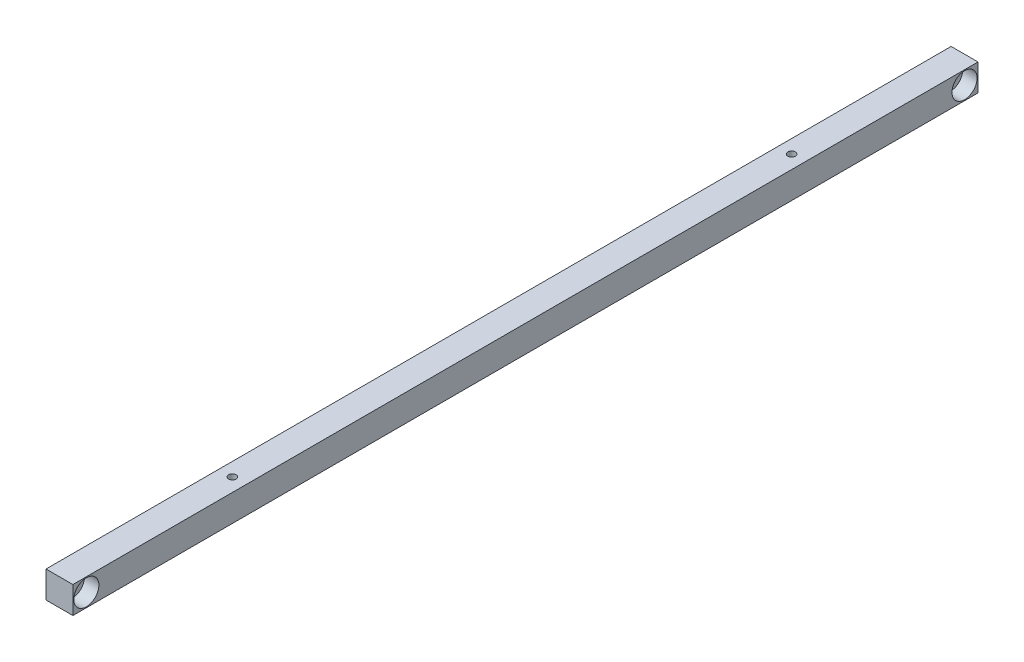
ISO-10303-21;
HEADER;
FILE_DESCRIPTION(('STEP AP214'),'2;1');
FILE_NAME('part.step','',(''),(''),'','','');
FILE_SCHEMA(('AUTOMOTIVE_DESIGN { 1 0 10303 214 1 1 1 1 }'));
ENDSEC;
DATA;
#1=APPLICATION_CONTEXT('core data for automotive mechanical design processes');
#2=APPLICATION_PROTOCOL_DEFINITION('international standard','automotive_design',2000,#1);
#3=PRODUCT_CONTEXT('',#1,'mechanical');
#4=PRODUCT('Part','Part','',(#3));
#5=PRODUCT_RELATED_PRODUCT_CATEGORY('part','',(#4));
#6=PRODUCT_DEFINITION_FORMATION('','',#4);
#7=PRODUCT_DEFINITION_CONTEXT('part definition',#1,'design');
#8=PRODUCT_DEFINITION('design','',#6,#7);
#9=PRODUCT_DEFINITION_SHAPE('','',#8);
#10=(LENGTH_UNIT() NAMED_UNIT(*) SI_UNIT(.MILLI.,.METRE.));
#11=(NAMED_UNIT(*) PLANE_ANGLE_UNIT() SI_UNIT($,.RADIAN.));
#12=(NAMED_UNIT(*) SI_UNIT($,.STERADIAN.) SOLID_ANGLE_UNIT());
#13=UNCERTAINTY_MEASURE_WITH_UNIT(LENGTH_MEASURE(1.E-05),#10,'distance_accuracy_value','');
#14=(GEOMETRIC_REPRESENTATION_CONTEXT(3) GLOBAL_UNCERTAINTY_ASSIGNED_CONTEXT((#13)) GLOBAL_UNIT_ASSIGNED_CONTEXT((#10,
#11,#12)) REPRESENTATION_CONTEXT('',''));
#15=CARTESIAN_POINT('',(0.,0.,0.));
#16=DIRECTION('',(0.,0.,1.));
#17=DIRECTION('',(1.,0.,0.));
#18=AXIS2_PLACEMENT_3D('',#15,#16,#17);
#19=CARTESIAN_POINT('',(-7.5,-7.5,252.5));
#20=DIRECTION('',(1.,0.,0.));
#21=DIRECTION('',(0.,0.,-1.));
#22=AXIS2_PLACEMENT_3D('',#19,#20,#21);
#23=PLANE('',#22);
#24=CARTESIAN_POINT('',(-7.5,0.,245.));
#25=DIRECTION('',(1.,0.,0.));
#26=DIRECTION('',(0.,0.,-1.));
#27=AXIS2_PLACEMENT_3D('',#24,#25,#26);
#28=CIRCLE('',#27,4.25000000000001);
#29=CARTESIAN_POINT('',(-7.5,0.,240.75));
#30=VERTEX_POINT('',#29);
#31=EDGE_CURVE('E162',#30,#30,#28,.T.);
#32=ORIENTED_EDGE('',*,*,#31,.T.);
#33=EDGE_LOOP('',(#32));
#34=FACE_BOUND('',#33,.T.);
#35=CARTESIAN_POINT('',(-7.5,0.,-245.));
#36=DIRECTION('',(1.,0.,0.));
#37=DIRECTION('',(0.,0.,-1.));
#38=AXIS2_PLACEMENT_3D('',#35,#36,#37);
#39=CIRCLE('',#38,4.25000000000001);
#40=CARTESIAN_POINT('',(-7.5,0.,-249.25));
#41=VERTEX_POINT('',#40);
#42=EDGE_CURVE('E121',#41,#41,#39,.T.);
#43=ORIENTED_EDGE('',*,*,#42,.T.);
#44=EDGE_LOOP('',(#43));
#45=FACE_BOUND('',#44,.T.);
#46=DIRECTION('',(0.,-1.,0.));
#47=VECTOR('',#46,1.);
#48=CARTESIAN_POINT('',(-7.5,-7.5,-252.5));
#49=LINE('',#48,#47);
#50=CARTESIAN_POINT('',(-7.5,7.5,-252.5));
#51=VERTEX_POINT('',#50);
#52=CARTESIAN_POINT('',(-7.5,-7.5,-252.5));
#53=VERTEX_POINT('',#52);
#54=EDGE_CURVE('E117',#51,#53,#49,.T.);
#55=ORIENTED_EDGE('',*,*,#54,.T.);
#56=DIRECTION('',(0.,0.,-1.));
#57=VECTOR('',#56,1.);
#58=CARTESIAN_POINT('',(-7.5,-7.5,252.5));
#59=LINE('',#58,#57);
#60=CARTESIAN_POINT('',(-7.5,-7.5,252.5));
#61=VERTEX_POINT('',#60);
#62=EDGE_CURVE('E11',#61,#53,#59,.T.);
#63=ORIENTED_EDGE('',*,*,#62,.F.);
#64=DIRECTION('',(0.,-1.,0.));
#65=VECTOR('',#64,1.);
#66=CARTESIAN_POINT('',(-7.5,-7.5,252.5));
#67=LINE('',#66,#65);
#68=CARTESIAN_POINT('',(-7.5,7.5,252.5));
#69=VERTEX_POINT('',#68);
#70=EDGE_CURVE('E99',#69,#61,#67,.T.);
#71=ORIENTED_EDGE('',*,*,#70,.F.);
#72=DIRECTION('',(0.,0.,-1.));
#73=VECTOR('',#72,1.);
#74=CARTESIAN_POINT('',(-7.5,7.5,252.5));
#75=LINE('',#74,#73);
#76=EDGE_CURVE('E113',#69,#51,#75,.T.);
#77=ORIENTED_EDGE('',*,*,#76,.T.);
#78=EDGE_LOOP('',(#55,#63,#71,#77));
#79=FACE_BOUND('',#78,.T.);
#80=ADVANCED_FACE('F45',(#34,#45,#79),#23,.F.);
#81=CARTESIAN_POINT('',(7.5,-7.5,252.5));
#82=DIRECTION('',(0.,1.,0.));
#83=DIRECTION('',(-1.,0.,0.));
#84=AXIS2_PLACEMENT_3D('',#81,#82,#83);
#85=PLANE('',#84);
#86=CARTESIAN_POINT('',(0.,-7.5,-155.996395214031));
#87=DIRECTION('',(0.,-1.,0.));
#88=DIRECTION('',(0.,0.,-1.));
#89=AXIS2_PLACEMENT_3D('',#86,#87,#88);
#90=CIRCLE('',#89,2.525);
#91=CARTESIAN_POINT('',(0.,-7.5,-158.521395214031));
#92=VERTEX_POINT('',#91);
#93=EDGE_CURVE('E419',#92,#92,#90,.T.);
#94=ORIENTED_EDGE('',*,*,#93,.F.);
#95=EDGE_LOOP('',(#94));
#96=FACE_BOUND('',#95,.T.);
#97=CARTESIAN_POINT('',(0.,-7.5,155.996395214031));
#98=DIRECTION('',(0.,-1.,0.));
#99=DIRECTION('',(0.,0.,-1.));
#100=AXIS2_PLACEMENT_3D('',#97,#98,#99);
#101=CIRCLE('',#100,2.525);
#102=CARTESIAN_POINT('',(0.,-7.5,153.471395214031));
#103=VERTEX_POINT('',#102);
#104=EDGE_CURVE('E145',#103,#103,#101,.T.);
#105=ORIENTED_EDGE('',*,*,#104,.F.);
#106=EDGE_LOOP('',(#105));
#107=FACE_BOUND('',#106,.T.);
#108=DIRECTION('',(1.,0.,0.));
#109=VECTOR('',#108,1.);
#110=CARTESIAN_POINT('',(7.5,-7.5,-252.5));
#111=LINE('',#110,#109);
#112=CARTESIAN_POINT('',(7.5,-7.5,-252.5));
#113=VERTEX_POINT('',#112);
#114=EDGE_CURVE('E104',#53,#113,#111,.T.);
#115=ORIENTED_EDGE('',*,*,#114,.T.);
#116=DIRECTION('',(0.,0.,-1.));
#117=VECTOR('',#116,1.);
#118=CARTESIAN_POINT('',(7.5,-7.5,252.5));
#119=LINE('',#118,#117);
#120=CARTESIAN_POINT('',(7.5,-7.5,252.5));
#121=VERTEX_POINT('',#120);
#122=EDGE_CURVE('E55',#121,#113,#119,.T.);
#123=ORIENTED_EDGE('',*,*,#122,.F.);
#124=DIRECTION('',(1.,0.,0.));
#125=VECTOR('',#124,1.);
#126=CARTESIAN_POINT('',(7.5,-7.5,252.5));
#127=LINE('',#126,#125);
#128=EDGE_CURVE('E94',#61,#121,#127,.T.);
#129=ORIENTED_EDGE('',*,*,#128,.F.);
#130=ORIENTED_EDGE('',*,*,#62,.T.);
#131=EDGE_LOOP('',(#115,#123,#129,#130));
#132=FACE_BOUND('',#131,.T.);
#133=ADVANCED_FACE('F103',(#96,#107,#132),#85,.F.);
#134=CARTESIAN_POINT('',(7.5,-7.5,252.5));
#135=DIRECTION('',(-1.,0.,0.));
#136=DIRECTION('',(0.,0.,1.));
#137=AXIS2_PLACEMENT_3D('',#134,#135,#136);
#138=PLANE('',#137);
#139=CARTESIAN_POINT('',(7.5,0.,245.));
#140=DIRECTION('',(1.,0.,0.));
#141=DIRECTION('',(0.,0.,-1.));
#142=AXIS2_PLACEMENT_3D('',#139,#140,#141);
#143=CIRCLE('',#142,7.00000000000001);
#144=CARTESIAN_POINT('',(7.5,0.,238.));
#145=VERTEX_POINT('',#144);
#146=EDGE_CURVE('E134',#145,#145,#143,.T.);
#147=ORIENTED_EDGE('',*,*,#146,.F.);
#148=EDGE_LOOP('',(#147));
#149=FACE_BOUND('',#148,.T.);
#150=CARTESIAN_POINT('',(7.5,0.,-245.));
#151=DIRECTION('',(1.,0.,0.));
#152=DIRECTION('',(0.,0.,-1.));
#153=AXIS2_PLACEMENT_3D('',#150,#151,#152);
#154=CIRCLE('',#153,7.00000000000001);
#155=CARTESIAN_POINT('',(7.5,0.,-252.));
#156=VERTEX_POINT('',#155);
#157=EDGE_CURVE('E166',#156,#156,#154,.T.);
#158=ORIENTED_EDGE('',*,*,#157,.F.);
#159=EDGE_LOOP('',(#158));
#160=FACE_BOUND('',#159,.T.);
#161=DIRECTION('',(0.,1.,0.));
#162=VECTOR('',#161,1.);
#163=CARTESIAN_POINT('',(7.5,-7.5,-252.5));
#164=LINE('',#163,#162);
#165=CARTESIAN_POINT('',(7.5,7.5,-252.5));
#166=VERTEX_POINT('',#165);
#167=EDGE_CURVE('E81',#113,#166,#164,.T.);
#168=ORIENTED_EDGE('',*,*,#167,.T.);
#169=DIRECTION('',(0.,0.,-1.));
#170=VECTOR('',#169,1.);
#171=CARTESIAN_POINT('',(7.5,7.5,252.5));
#172=LINE('',#171,#170);
#173=CARTESIAN_POINT('',(7.5,7.5,252.5));
#174=VERTEX_POINT('',#173);
#175=EDGE_CURVE('E106',#174,#166,#172,.T.);
#176=ORIENTED_EDGE('',*,*,#175,.F.);
#177=DIRECTION('',(0.,1.,0.));
#178=VECTOR('',#177,1.);
#179=CARTESIAN_POINT('',(7.5,-7.5,252.5));
#180=LINE('',#179,#178);
#181=EDGE_CURVE('E97',#121,#174,#180,.T.);
#182=ORIENTED_EDGE('',*,*,#181,.F.);
#183=ORIENTED_EDGE('',*,*,#122,.T.);
#184=EDGE_LOOP('',(#168,#176,#182,#183));
#185=FACE_BOUND('',#184,.T.);
#186=ADVANCED_FACE('F108',(#149,#160,#185),#138,.F.);
#187=CARTESIAN_POINT('',(7.5,7.5,252.5));
#188=DIRECTION('',(0.,-1.,0.));
#189=DIRECTION('',(1.,0.,0.));
#190=AXIS2_PLACEMENT_3D('',#187,#188,#189);
#191=PLANE('',#190);
#192=CARTESIAN_POINT('',(0.,7.5,-155.996395214031));
#193=DIRECTION('',(0.,-1.,0.));
#194=DIRECTION('',(1.,0.,0.));
#195=AXIS2_PLACEMENT_3D('',#192,#193,#194);
#196=CIRCLE('',#195,2.1);
#197=CARTESIAN_POINT('',(2.1,7.5,-155.996395214031));
#198=VERTEX_POINT('',#197);
#199=EDGE_CURVE('E48',#198,#198,#196,.T.);
#200=ORIENTED_EDGE('',*,*,#199,.T.);
#201=EDGE_LOOP('',(#200));
#202=FACE_BOUND('',#201,.T.);
#203=CARTESIAN_POINT('',(0.,7.5,155.996395214031));
#204=DIRECTION('',(0.,-1.,0.));
#205=DIRECTION('',(1.,0.,0.));
#206=AXIS2_PLACEMENT_3D('',#203,#204,#205);
#207=CIRCLE('',#206,2.1);
#208=CARTESIAN_POINT('',(2.1,7.5,155.996395214031));
#209=VERTEX_POINT('',#208);
#210=EDGE_CURVE('E131',#209,#209,#207,.T.);
#211=ORIENTED_EDGE('',*,*,#210,.T.);
#212=EDGE_LOOP('',(#211));
#213=FACE_BOUND('',#212,.T.);
#214=DIRECTION('',(-1.,0.,0.));
#215=VECTOR('',#214,1.);
#216=CARTESIAN_POINT('',(7.5,7.5,-252.5));
#217=LINE('',#216,#215);
#218=EDGE_CURVE('E87',#166,#51,#217,.T.);
#219=ORIENTED_EDGE('',*,*,#218,.T.);
#220=ORIENTED_EDGE('',*,*,#76,.F.);
#221=DIRECTION('',(-1.,0.,0.));
#222=VECTOR('',#221,1.);
#223=CARTESIAN_POINT('',(7.5,7.5,252.5));
#224=LINE('',#223,#222);
#225=EDGE_CURVE('E64',#174,#69,#224,.T.);
#226=ORIENTED_EDGE('',*,*,#225,.F.);
#227=ORIENTED_EDGE('',*,*,#175,.T.);
#228=EDGE_LOOP('',(#219,#220,#226,#227));
#229=FACE_BOUND('',#228,.T.);
#230=ADVANCED_FACE('F220',(#202,#213,#229),#191,.F.);
#231=CARTESIAN_POINT('',(0.,0.,252.5));
#232=DIRECTION('',(0.,0.,1.));
#233=DIRECTION('',(1.,0.,0.));
#234=AXIS2_PLACEMENT_3D('',#231,#232,#233);
#235=PLANE('',#234);
#236=ORIENTED_EDGE('',*,*,#70,.T.);
#237=ORIENTED_EDGE('',*,*,#128,.T.);
#238=ORIENTED_EDGE('',*,*,#181,.T.);
#239=ORIENTED_EDGE('',*,*,#225,.T.);
#240=EDGE_LOOP('',(#236,#237,#238,#239));
#241=FACE_BOUND('',#240,.T.);
#242=ADVANCED_FACE('F95',(#241),#235,.T.);
#243=CARTESIAN_POINT('',(0.,0.,-252.5));
#244=DIRECTION('',(0.,0.,1.));
#245=DIRECTION('',(1.,0.,0.));
#246=AXIS2_PLACEMENT_3D('',#243,#244,#245);
#247=PLANE('',#246);
#248=ORIENTED_EDGE('',*,*,#54,.F.);
#249=ORIENTED_EDGE('',*,*,#218,.F.);
#250=ORIENTED_EDGE('',*,*,#167,.F.);
#251=ORIENTED_EDGE('',*,*,#114,.F.);
#252=EDGE_LOOP('',(#248,#249,#250,#251));
#253=FACE_BOUND('',#252,.T.);
#254=ADVANCED_FACE('F203',(#253),#247,.F.);
#255=CARTESIAN_POINT('',(7.5,0.,-245.));
#256=DIRECTION('',(1.,0.,0.));
#257=DIRECTION('',(0.,0.,-1.));
#258=AXIS2_PLACEMENT_3D('',#255,#256,#257);
#259=CYLINDRICAL_SURFACE('',#258,4.25000000000001);
#260=ORIENTED_EDGE('',*,*,#42,.F.);
#261=EDGE_LOOP('',(#260));
#262=FACE_BOUND('',#261,.T.);
#263=CARTESIAN_POINT('',(-0.5,0.,-245.));
#264=DIRECTION('',(1.,0.,0.));
#265=DIRECTION('',(0.,0.,-1.));
#266=AXIS2_PLACEMENT_3D('',#263,#264,#265);
#267=CIRCLE('',#266,4.25000000000001);
#268=CARTESIAN_POINT('',(-0.5,0.,-249.25));
#269=VERTEX_POINT('',#268);
#270=EDGE_CURVE('E174',#269,#269,#267,.T.);
#271=ORIENTED_EDGE('',*,*,#270,.T.);
#272=EDGE_LOOP('',(#271));
#273=FACE_BOUND('',#272,.T.);
#274=ADVANCED_FACE('F199',(#262,#273),#259,.F.);
#275=CARTESIAN_POINT('',(-0.5,4.25000000000002,-245.));
#276=DIRECTION('',(-1.,0.,0.));
#277=DIRECTION('',(0.,0.,1.));
#278=AXIS2_PLACEMENT_3D('',#275,#276,#277);
#279=PLANE('',#278);
#280=ORIENTED_EDGE('',*,*,#270,.F.);
#281=EDGE_LOOP('',(#280));
#282=FACE_BOUND('',#281,.T.);
#283=CARTESIAN_POINT('',(-0.5,0.,-245.));
#284=DIRECTION('',(1.,0.,0.));
#285=DIRECTION('',(0.,0.,-1.));
#286=AXIS2_PLACEMENT_3D('',#283,#284,#285);
#287=CIRCLE('',#286,7.00000000000001);
#288=CARTESIAN_POINT('',(-0.5,0.,-252.));
#289=VERTEX_POINT('',#288);
#290=EDGE_CURVE('E170',#289,#289,#287,.T.);
#291=ORIENTED_EDGE('',*,*,#290,.T.);
#292=EDGE_LOOP('',(#291));
#293=FACE_BOUND('',#292,.T.);
#294=ADVANCED_FACE('F202',(#282,#293),#279,.F.);
#295=CARTESIAN_POINT('',(7.5,0.,-245.));
#296=DIRECTION('',(1.,0.,0.));
#297=DIRECTION('',(0.,0.,-1.));
#298=AXIS2_PLACEMENT_3D('',#295,#296,#297);
#299=CYLINDRICAL_SURFACE('',#298,7.00000000000001);
#300=ORIENTED_EDGE('',*,*,#290,.F.);
#301=EDGE_LOOP('',(#300));
#302=FACE_BOUND('',#301,.T.);
#303=ORIENTED_EDGE('',*,*,#157,.T.);
#304=EDGE_LOOP('',(#303));
#305=FACE_BOUND('',#304,.T.);
#306=ADVANCED_FACE('F209',(#302,#305),#299,.F.);
#307=CARTESIAN_POINT('',(7.5,0.,245.));
#308=DIRECTION('',(1.,0.,0.));
#309=DIRECTION('',(0.,0.,-1.));
#310=AXIS2_PLACEMENT_3D('',#307,#308,#309);
#311=CYLINDRICAL_SURFACE('',#310,4.25000000000001);
#312=ORIENTED_EDGE('',*,*,#31,.F.);
#313=EDGE_LOOP('',(#312));
#314=FACE_BOUND('',#313,.T.);
#315=CARTESIAN_POINT('',(-0.5,0.,245.));
#316=DIRECTION('',(1.,0.,0.));
#317=DIRECTION('',(0.,0.,-1.));
#318=AXIS2_PLACEMENT_3D('',#315,#316,#317);
#319=CIRCLE('',#318,4.25000000000001);
#320=CARTESIAN_POINT('',(-0.5,0.,240.75));
#321=VERTEX_POINT('',#320);
#322=EDGE_CURVE('E158',#321,#321,#319,.T.);
#323=ORIENTED_EDGE('',*,*,#322,.T.);
#324=EDGE_LOOP('',(#323));
#325=FACE_BOUND('',#324,.T.);
#326=ADVANCED_FACE('F215',(#314,#325),#311,.F.);
#327=CARTESIAN_POINT('',(-0.5,4.25000000000002,245.));
#328=DIRECTION('',(-1.,0.,0.));
#329=DIRECTION('',(0.,0.,1.));
#330=AXIS2_PLACEMENT_3D('',#327,#328,#329);
#331=PLANE('',#330);
#332=ORIENTED_EDGE('',*,*,#322,.F.);
#333=EDGE_LOOP('',(#332));
#334=FACE_BOUND('',#333,.T.);
#335=CARTESIAN_POINT('',(-0.5,0.,245.));
#336=DIRECTION('',(1.,0.,0.));
#337=DIRECTION('',(0.,0.,-1.));
#338=AXIS2_PLACEMENT_3D('',#335,#336,#337);
#339=CIRCLE('',#338,7.00000000000001);
#340=CARTESIAN_POINT('',(-0.5,0.,238.));
#341=VERTEX_POINT('',#340);
#342=EDGE_CURVE('E142',#341,#341,#339,.T.);
#343=ORIENTED_EDGE('',*,*,#342,.T.);
#344=EDGE_LOOP('',(#343));
#345=FACE_BOUND('',#344,.T.);
#346=ADVANCED_FACE('F239',(#334,#345),#331,.F.);
#347=CARTESIAN_POINT('',(7.5,0.,245.));
#348=DIRECTION('',(1.,0.,0.));
#349=DIRECTION('',(0.,0.,-1.));
#350=AXIS2_PLACEMENT_3D('',#347,#348,#349);
#351=CYLINDRICAL_SURFACE('',#350,7.00000000000001);
#352=ORIENTED_EDGE('',*,*,#342,.F.);
#353=EDGE_LOOP('',(#352));
#354=FACE_BOUND('',#353,.T.);
#355=ORIENTED_EDGE('',*,*,#146,.T.);
#356=EDGE_LOOP('',(#355));
#357=FACE_BOUND('',#356,.T.);
#358=ADVANCED_FACE('F245',(#354,#357),#351,.F.);
#359=CARTESIAN_POINT('',(0.,-7.5,155.996395214031));
#360=DIRECTION('',(0.,-1.,0.));
#361=DIRECTION('',(0.,0.,-1.));
#362=AXIS2_PLACEMENT_3D('',#359,#360,#361);
#363=CYLINDRICAL_SURFACE('',#362,2.1);
#364=CARTESIAN_POINT('',(0.,-7.075,155.996395214031));
#365=DIRECTION('',(0.,-1.,0.));
#366=DIRECTION('',(0.,0.,-1.));
#367=AXIS2_PLACEMENT_3D('',#364,#365,#366);
#368=CIRCLE('',#367,2.1);
#369=CARTESIAN_POINT('',(0.,-7.075,153.896395214031));
#370=VERTEX_POINT('',#369);
#371=EDGE_CURVE('E135',#370,#370,#368,.T.);
#372=ORIENTED_EDGE('',*,*,#371,.T.);
#373=EDGE_LOOP('',(#372));
#374=FACE_BOUND('',#373,.T.);
#375=ORIENTED_EDGE('',*,*,#210,.F.);
#376=EDGE_LOOP('',(#375));
#377=FACE_BOUND('',#376,.T.);
#378=ADVANCED_FACE('F251',(#374,#377),#363,.F.);
#379=CARTESIAN_POINT('',(0.,-7.5,155.996395214031));
#380=DIRECTION('',(0.,-1.,0.));
#381=DIRECTION('',(0.,0.,-1.));
#382=AXIS2_PLACEMENT_3D('',#379,#380,#381);
#383=CONICAL_SURFACE('',#382,2.525,0.78539816339745);
#384=ORIENTED_EDGE('',*,*,#371,.F.);
#385=EDGE_LOOP('',(#384));
#386=FACE_BOUND('',#385,.T.);
#387=ORIENTED_EDGE('',*,*,#104,.T.);
#388=EDGE_LOOP('',(#387));
#389=FACE_BOUND('',#388,.T.);
#390=ADVANCED_FACE('F256',(#386,#389),#383,.F.);
#391=CARTESIAN_POINT('',(0.,-7.5,-155.996395214031));
#392=DIRECTION('',(0.,-1.,0.));
#393=DIRECTION('',(0.,0.,-1.));
#394=AXIS2_PLACEMENT_3D('',#391,#392,#393);
#395=CYLINDRICAL_SURFACE('',#394,2.1);
#396=CARTESIAN_POINT('',(0.,-7.075,-155.996395214031));
#397=DIRECTION('',(0.,-1.,0.));
#398=DIRECTION('',(0.,0.,-1.));
#399=AXIS2_PLACEMENT_3D('',#396,#397,#398);
#400=CIRCLE('',#399,2.1);
#401=CARTESIAN_POINT('',(0.,-7.075,-158.096395214031));
#402=VERTEX_POINT('',#401);
#403=EDGE_CURVE('E416',#402,#402,#400,.T.);
#404=ORIENTED_EDGE('',*,*,#403,.T.);
#405=EDGE_LOOP('',(#404));
#406=FACE_BOUND('',#405,.T.);
#407=ORIENTED_EDGE('',*,*,#199,.F.);
#408=EDGE_LOOP('',(#407));
#409=FACE_BOUND('',#408,.T.);
#410=ADVANCED_FACE('F330',(#406,#409),#395,.F.);
#411=CARTESIAN_POINT('',(0.,-7.5,-155.996395214031));
#412=DIRECTION('',(0.,-1.,0.));
#413=DIRECTION('',(0.,0.,-1.));
#414=AXIS2_PLACEMENT_3D('',#411,#412,#413);
#415=CONICAL_SURFACE('',#414,2.525,0.78539816339745);
#416=ORIENTED_EDGE('',*,*,#403,.F.);
#417=EDGE_LOOP('',(#416));
#418=FACE_BOUND('',#417,.T.);
#419=ORIENTED_EDGE('',*,*,#93,.T.);
#420=EDGE_LOOP('',(#419));
#421=FACE_BOUND('',#420,.T.);
#422=ADVANCED_FACE('F341',(#418,#421),#415,.F.);
#423=CLOSED_SHELL('',(#80,#133,#186,#230,#242,#254,#274,#294,#306,#326,#346,#358,#378,#390,#410,#422));
#424=MANIFOLD_SOLID_BREP('B2',#423);
#425=ADVANCED_BREP_SHAPE_REPRESENTATION('',(#18,#424),#14);
#426=SHAPE_DEFINITION_REPRESENTATION(#9,#425);
ENDSEC;
END-ISO-10303-21;
